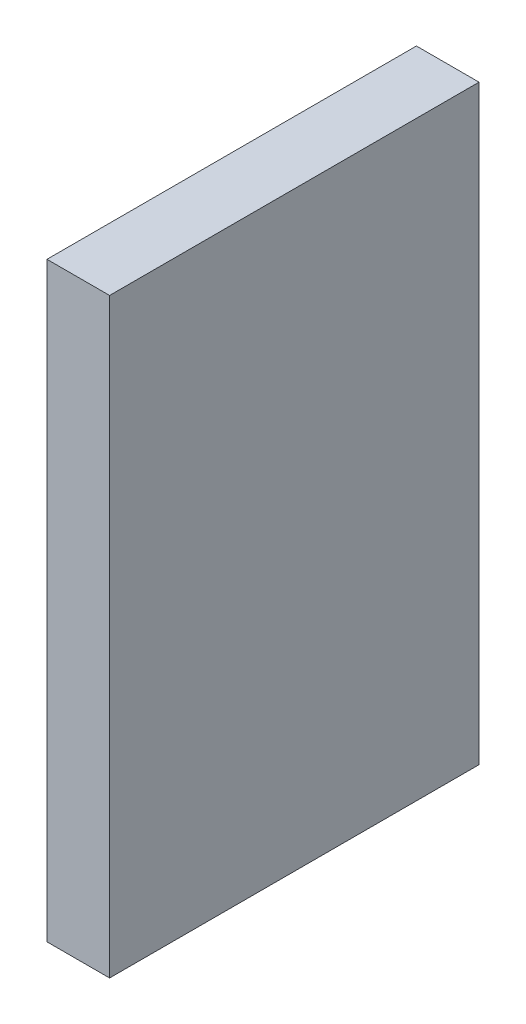
ISO-10303-21;
HEADER;
FILE_DESCRIPTION(('STEP AP214'),'2;1');
FILE_NAME('part.step','',(''),(''),'','','');
FILE_SCHEMA(('AUTOMOTIVE_DESIGN { 1 0 10303 214 1 1 1 1 }'));
ENDSEC;
DATA;
#1=APPLICATION_CONTEXT('core data for automotive mechanical design processes');
#2=APPLICATION_PROTOCOL_DEFINITION('international standard','automotive_design',2000,#1);
#3=PRODUCT_CONTEXT('',#1,'mechanical');
#4=PRODUCT('Part','Part','',(#3));
#5=PRODUCT_RELATED_PRODUCT_CATEGORY('part','',(#4));
#6=PRODUCT_DEFINITION_FORMATION('','',#4);
#7=PRODUCT_DEFINITION_CONTEXT('part definition',#1,'design');
#8=PRODUCT_DEFINITION('design','',#6,#7);
#9=PRODUCT_DEFINITION_SHAPE('','',#8);
#10=(LENGTH_UNIT() NAMED_UNIT(*) SI_UNIT(.MILLI.,.METRE.));
#11=(NAMED_UNIT(*) PLANE_ANGLE_UNIT() SI_UNIT($,.RADIAN.));
#12=(NAMED_UNIT(*) SI_UNIT($,.STERADIAN.) SOLID_ANGLE_UNIT());
#13=UNCERTAINTY_MEASURE_WITH_UNIT(LENGTH_MEASURE(1.E-05),#10,'distance_accuracy_value','');
#14=(GEOMETRIC_REPRESENTATION_CONTEXT(3) GLOBAL_UNCERTAINTY_ASSIGNED_CONTEXT((#13)) GLOBAL_UNIT_ASSIGNED_CONTEXT((#10,
#11,#12)) REPRESENTATION_CONTEXT('',''));
#15=CARTESIAN_POINT('',(0.,0.,0.));
#16=DIRECTION('',(0.,0.,1.));
#17=DIRECTION('',(1.,0.,0.));
#18=AXIS2_PLACEMENT_3D('',#15,#16,#17);
#19=CARTESIAN_POINT('',(-31.75,299.72,-200.025));
#20=DIRECTION('',(1.,0.,0.));
#21=DIRECTION('',(0.,0.,-1.));
#22=AXIS2_PLACEMENT_3D('',#19,#20,#21);
#23=PLANE('',#22);
#24=DIRECTION('',(0.,0.,1.));
#25=VECTOR('',#24,1.);
#26=CARTESIAN_POINT('',(-31.75,-299.72,-200.025));
#27=LINE('',#26,#25);
#28=CARTESIAN_POINT('',(-31.75,-299.72,-200.025));
#29=VERTEX_POINT('',#28);
#30=CARTESIAN_POINT('',(-31.75,-299.72,174.625));
#31=VERTEX_POINT('',#30);
#32=EDGE_CURVE('E113',#29,#31,#27,.T.);
#33=ORIENTED_EDGE('',*,*,#32,.T.);
#34=DIRECTION('',(0.,-1.,0.));
#35=VECTOR('',#34,1.);
#36=CARTESIAN_POINT('',(-31.75,299.72,174.625));
#37=LINE('',#36,#35);
#38=CARTESIAN_POINT('',(-31.75,299.72,174.625));
#39=VERTEX_POINT('',#38);
#40=EDGE_CURVE('E11',#39,#31,#37,.T.);
#41=ORIENTED_EDGE('',*,*,#40,.F.);
#42=DIRECTION('',(0.,0.,1.));
#43=VECTOR('',#42,1.);
#44=CARTESIAN_POINT('',(-31.75,299.72,-200.025));
#45=LINE('',#44,#43);
#46=CARTESIAN_POINT('',(-31.75,299.72,-200.025));
#47=VERTEX_POINT('',#46);
#48=EDGE_CURVE('E97',#47,#39,#45,.T.);
#49=ORIENTED_EDGE('',*,*,#48,.F.);
#50=DIRECTION('',(0.,-1.,0.));
#51=VECTOR('',#50,1.);
#52=CARTESIAN_POINT('',(-31.75,299.72,-200.025));
#53=LINE('',#52,#51);
#54=EDGE_CURVE('E109',#47,#29,#53,.T.);
#55=ORIENTED_EDGE('',*,*,#54,.T.);
#56=EDGE_LOOP('',(#33,#41,#49,#55));
#57=FACE_BOUND('',#56,.T.);
#58=ADVANCED_FACE('F45',(#57),#23,.F.);
#59=CARTESIAN_POINT('',(-31.75,299.72,174.625));
#60=DIRECTION('',(0.,0.,-1.));
#61=DIRECTION('',(-1.,0.,0.));
#62=AXIS2_PLACEMENT_3D('',#59,#60,#61);
#63=PLANE('',#62);
#64=DIRECTION('',(1.,0.,0.));
#65=VECTOR('',#64,1.);
#66=CARTESIAN_POINT('',(-31.75,-299.72,174.625));
#67=LINE('',#66,#65);
#68=CARTESIAN_POINT('',(31.75,-299.72,174.625));
#69=VERTEX_POINT('',#68);
#70=EDGE_CURVE('E102',#31,#69,#67,.T.);
#71=ORIENTED_EDGE('',*,*,#70,.T.);
#72=DIRECTION('',(0.,-1.,0.));
#73=VECTOR('',#72,1.);
#74=CARTESIAN_POINT('',(31.75,299.72,174.625));
#75=LINE('',#74,#73);
#76=CARTESIAN_POINT('',(31.75,299.72,174.625));
#77=VERTEX_POINT('',#76);
#78=EDGE_CURVE('E54',#77,#69,#75,.T.);
#79=ORIENTED_EDGE('',*,*,#78,.F.);
#80=DIRECTION('',(1.,0.,0.));
#81=VECTOR('',#80,1.);
#82=CARTESIAN_POINT('',(-31.75,299.72,174.625));
#83=LINE('',#82,#81);
#84=EDGE_CURVE('E92',#39,#77,#83,.T.);
#85=ORIENTED_EDGE('',*,*,#84,.F.);
#86=ORIENTED_EDGE('',*,*,#40,.T.);
#87=EDGE_LOOP('',(#71,#79,#85,#86));
#88=FACE_BOUND('',#87,.T.);
#89=ADVANCED_FACE('F101',(#88),#63,.F.);
#90=CARTESIAN_POINT('',(31.75,299.72,-200.025));
#91=DIRECTION('',(-1.,0.,0.));
#92=DIRECTION('',(0.,0.,1.));
#93=AXIS2_PLACEMENT_3D('',#90,#91,#92);
#94=PLANE('',#93);
#95=DIRECTION('',(0.,0.,-1.));
#96=VECTOR('',#95,1.);
#97=CARTESIAN_POINT('',(31.75,-299.72,-200.025));
#98=LINE('',#97,#96);
#99=CARTESIAN_POINT('',(31.75,-299.72,-200.025));
#100=VERTEX_POINT('',#99);
#101=EDGE_CURVE('E79',#69,#100,#98,.T.);
#102=ORIENTED_EDGE('',*,*,#101,.T.);
#103=DIRECTION('',(0.,-1.,0.));
#104=VECTOR('',#103,1.);
#105=CARTESIAN_POINT('',(31.75,299.72,-200.025));
#106=LINE('',#105,#104);
#107=CARTESIAN_POINT('',(31.75,299.72,-200.025));
#108=VERTEX_POINT('',#107);
#109=EDGE_CURVE('E104',#108,#100,#106,.T.);
#110=ORIENTED_EDGE('',*,*,#109,.F.);
#111=DIRECTION('',(0.,0.,-1.));
#112=VECTOR('',#111,1.);
#113=CARTESIAN_POINT('',(31.75,299.72,-200.025));
#114=LINE('',#113,#112);
#115=EDGE_CURVE('E95',#77,#108,#114,.T.);
#116=ORIENTED_EDGE('',*,*,#115,.F.);
#117=ORIENTED_EDGE('',*,*,#78,.T.);
#118=EDGE_LOOP('',(#102,#110,#116,#117));
#119=FACE_BOUND('',#118,.T.);
#120=ADVANCED_FACE('F105',(#119),#94,.F.);
#121=CARTESIAN_POINT('',(-31.75,299.72,-200.025));
#122=DIRECTION('',(0.,0.,1.));
#123=DIRECTION('',(1.,0.,0.));
#124=AXIS2_PLACEMENT_3D('',#121,#122,#123);
#125=PLANE('',#124);
#126=DIRECTION('',(-1.,0.,0.));
#127=VECTOR('',#126,1.);
#128=CARTESIAN_POINT('',(-31.75,-299.72,-200.025));
#129=LINE('',#128,#127);
#130=EDGE_CURVE('E85',#100,#29,#129,.T.);
#131=ORIENTED_EDGE('',*,*,#130,.T.);
#132=ORIENTED_EDGE('',*,*,#54,.F.);
#133=DIRECTION('',(-1.,0.,0.));
#134=VECTOR('',#133,1.);
#135=CARTESIAN_POINT('',(-31.75,299.72,-200.025));
#136=LINE('',#135,#134);
#137=EDGE_CURVE('E62',#108,#47,#136,.T.);
#138=ORIENTED_EDGE('',*,*,#137,.F.);
#139=ORIENTED_EDGE('',*,*,#109,.T.);
#140=EDGE_LOOP('',(#131,#132,#138,#139));
#141=FACE_BOUND('',#140,.T.);
#142=ADVANCED_FACE('F126',(#141),#125,.F.);
#143=CARTESIAN_POINT('',(0.,299.72,0.));
#144=DIRECTION('',(0.,1.,0.));
#145=DIRECTION('',(0.,0.,1.));
#146=AXIS2_PLACEMENT_3D('',#143,#144,#145);
#147=PLANE('',#146);
#148=ORIENTED_EDGE('',*,*,#48,.T.);
#149=ORIENTED_EDGE('',*,*,#84,.T.);
#150=ORIENTED_EDGE('',*,*,#115,.T.);
#151=ORIENTED_EDGE('',*,*,#137,.T.);
#152=EDGE_LOOP('',(#148,#149,#150,#151));
#153=FACE_BOUND('',#152,.T.);
#154=ADVANCED_FACE('F93',(#153),#147,.T.);
#155=CARTESIAN_POINT('',(0.,-299.72,0.));
#156=DIRECTION('',(0.,1.,0.));
#157=DIRECTION('',(0.,0.,1.));
#158=AXIS2_PLACEMENT_3D('',#155,#156,#157);
#159=PLANE('',#158);
#160=ORIENTED_EDGE('',*,*,#32,.F.);
#161=ORIENTED_EDGE('',*,*,#130,.F.);
#162=ORIENTED_EDGE('',*,*,#101,.F.);
#163=ORIENTED_EDGE('',*,*,#70,.F.);
#164=EDGE_LOOP('',(#160,#161,#162,#163));
#165=FACE_BOUND('',#164,.T.);
#166=ADVANCED_FACE('F129',(#165),#159,.F.);
#167=CLOSED_SHELL('',(#58,#89,#120,#142,#154,#166));
#168=MANIFOLD_SOLID_BREP('B2',#167);
#169=ADVANCED_BREP_SHAPE_REPRESENTATION('',(#18,#168),#14);
#170=SHAPE_DEFINITION_REPRESENTATION(#9,#169);
ENDSEC;
END-ISO-10303-21;
